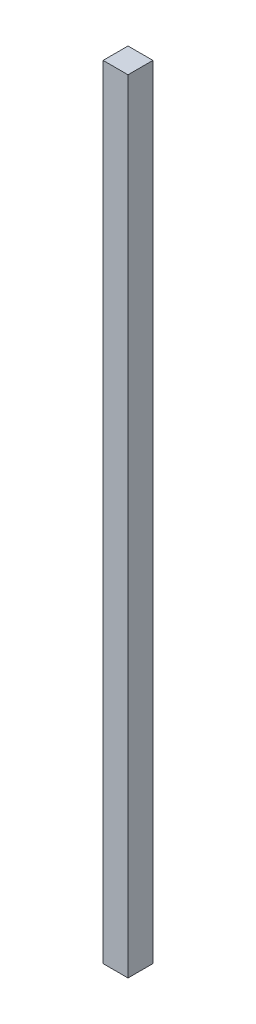
ISO-10303-21;
HEADER;
FILE_DESCRIPTION(('STEP AP214'),'2;1');
FILE_NAME('part.step','',(''),(''),'','','');
FILE_SCHEMA(('AUTOMOTIVE_DESIGN { 1 0 10303 214 1 1 1 1 }'));
ENDSEC;
DATA;
#1=APPLICATION_CONTEXT('core data for automotive mechanical design processes');
#2=APPLICATION_PROTOCOL_DEFINITION('international standard','automotive_design',2000,#1);
#3=PRODUCT_CONTEXT('',#1,'mechanical');
#4=PRODUCT('Part','Part','',(#3));
#5=PRODUCT_RELATED_PRODUCT_CATEGORY('part','',(#4));
#6=PRODUCT_DEFINITION_FORMATION('','',#4);
#7=PRODUCT_DEFINITION_CONTEXT('part definition',#1,'design');
#8=PRODUCT_DEFINITION('design','',#6,#7);
#9=PRODUCT_DEFINITION_SHAPE('','',#8);
#10=(LENGTH_UNIT() NAMED_UNIT(*) SI_UNIT(.MILLI.,.METRE.));
#11=(NAMED_UNIT(*) PLANE_ANGLE_UNIT() SI_UNIT($,.RADIAN.));
#12=(NAMED_UNIT(*) SI_UNIT($,.STERADIAN.) SOLID_ANGLE_UNIT());
#13=UNCERTAINTY_MEASURE_WITH_UNIT(LENGTH_MEASURE(1.E-05),#10,'distance_accuracy_value','');
#14=(GEOMETRIC_REPRESENTATION_CONTEXT(3) GLOBAL_UNCERTAINTY_ASSIGNED_CONTEXT((#13)) GLOBAL_UNIT_ASSIGNED_CONTEXT((#10,
#11,#12)) REPRESENTATION_CONTEXT('',''));
#15=CARTESIAN_POINT('',(0.,0.,0.));
#16=DIRECTION('',(0.,0.,1.));
#17=DIRECTION('',(1.,0.,0.));
#18=AXIS2_PLACEMENT_3D('',#15,#16,#17);
#19=CARTESIAN_POINT('',(-5.94468085106385,797.56,-14.7265957446808));
#20=DIRECTION('',(1.,0.,0.));
#21=DIRECTION('',(0.,0.,-1.));
#22=AXIS2_PLACEMENT_3D('',#19,#20,#21);
#23=PLANE('',#22);
#24=DIRECTION('',(0.,0.,1.));
#25=VECTOR('',#24,1.);
#26=CARTESIAN_POINT('',(-5.94468085106385,0.,-14.7265957446808));
#27=LINE('',#26,#25);
#28=CARTESIAN_POINT('',(-5.94468085106385,0.,-14.7265957446808));
#29=VERTEX_POINT('',#28);
#30=CARTESIAN_POINT('',(-5.94468085106384,0.,10.6734042553192));
#31=VERTEX_POINT('',#30);
#32=EDGE_CURVE('E96',#29,#31,#27,.T.);
#33=ORIENTED_EDGE('',*,*,#32,.T.);
#34=DIRECTION('',(0.,-1.,0.));
#35=VECTOR('',#34,1.);
#36=CARTESIAN_POINT('',(-5.94468085106384,797.56,10.6734042553192));
#37=LINE('',#36,#35);
#38=CARTESIAN_POINT('',(-5.94468085106384,797.56,10.6734042553192));
#39=VERTEX_POINT('',#38);
#40=EDGE_CURVE('E11',#39,#31,#37,.T.);
#41=ORIENTED_EDGE('',*,*,#40,.F.);
#42=DIRECTION('',(0.,0.,1.));
#43=VECTOR('',#42,1.);
#44=CARTESIAN_POINT('',(-5.94468085106385,797.56,-14.7265957446808));
#45=LINE('',#44,#43);
#46=CARTESIAN_POINT('',(-5.94468085106385,797.56,-14.7265957446808));
#47=VERTEX_POINT('',#46);
#48=EDGE_CURVE('E84',#47,#39,#45,.T.);
#49=ORIENTED_EDGE('',*,*,#48,.F.);
#50=DIRECTION('',(0.,-1.,0.));
#51=VECTOR('',#50,1.);
#52=CARTESIAN_POINT('',(-5.94468085106385,797.56,-14.7265957446808));
#53=LINE('',#52,#51);
#54=EDGE_CURVE('E92',#47,#29,#53,.T.);
#55=ORIENTED_EDGE('',*,*,#54,.T.);
#56=EDGE_LOOP('',(#33,#41,#49,#55));
#57=FACE_BOUND('',#56,.T.);
#58=ADVANCED_FACE('F33',(#57),#23,.F.);
#59=CARTESIAN_POINT('',(-5.94468085106384,797.56,10.6734042553192));
#60=DIRECTION('',(0.,0.,-1.));
#61=DIRECTION('',(-1.,0.,0.));
#62=AXIS2_PLACEMENT_3D('',#59,#60,#61);
#63=PLANE('',#62);
#64=DIRECTION('',(1.,0.,0.));
#65=VECTOR('',#64,1.);
#66=CARTESIAN_POINT('',(-5.94468085106384,0.,10.6734042553192));
#67=LINE('',#66,#65);
#68=CARTESIAN_POINT('',(19.4553191489362,0.,10.6734042553192));
#69=VERTEX_POINT('',#68);
#70=EDGE_CURVE('E88',#31,#69,#67,.T.);
#71=ORIENTED_EDGE('',*,*,#70,.T.);
#72=DIRECTION('',(0.,-1.,0.));
#73=VECTOR('',#72,1.);
#74=CARTESIAN_POINT('',(19.4553191489362,797.56,10.6734042553192));
#75=LINE('',#74,#73);
#76=CARTESIAN_POINT('',(19.4553191489362,797.56,10.6734042553192));
#77=VERTEX_POINT('',#76);
#78=EDGE_CURVE('E41',#77,#69,#75,.T.);
#79=ORIENTED_EDGE('',*,*,#78,.F.);
#80=DIRECTION('',(1.,0.,0.));
#81=VECTOR('',#80,1.);
#82=CARTESIAN_POINT('',(-5.94468085106384,797.56,10.6734042553192));
#83=LINE('',#82,#81);
#84=EDGE_CURVE('E79',#39,#77,#83,.T.);
#85=ORIENTED_EDGE('',*,*,#84,.F.);
#86=ORIENTED_EDGE('',*,*,#40,.T.);
#87=EDGE_LOOP('',(#71,#79,#85,#86));
#88=FACE_BOUND('',#87,.T.);
#89=ADVANCED_FACE('F87',(#88),#63,.F.);
#90=CARTESIAN_POINT('',(19.4553191489362,797.56,-14.7265957446808));
#91=DIRECTION('',(-1.,0.,0.));
#92=DIRECTION('',(0.,0.,1.));
#93=AXIS2_PLACEMENT_3D('',#90,#91,#92);
#94=PLANE('',#93);
#95=DIRECTION('',(0.,0.,-1.));
#96=VECTOR('',#95,1.);
#97=CARTESIAN_POINT('',(19.4553191489362,0.,-14.7265957446808));
#98=LINE('',#97,#96);
#99=CARTESIAN_POINT('',(19.4553191489362,0.,-14.7265957446808));
#100=VERTEX_POINT('',#99);
#101=EDGE_CURVE('E66',#69,#100,#98,.T.);
#102=ORIENTED_EDGE('',*,*,#101,.T.);
#103=DIRECTION('',(0.,-1.,0.));
#104=VECTOR('',#103,1.);
#105=CARTESIAN_POINT('',(19.4553191489362,797.56,-14.7265957446808));
#106=LINE('',#105,#104);
#107=CARTESIAN_POINT('',(19.4553191489362,797.56,-14.7265957446808));
#108=VERTEX_POINT('',#107);
#109=EDGE_CURVE('E89',#108,#100,#106,.T.);
#110=ORIENTED_EDGE('',*,*,#109,.F.);
#111=DIRECTION('',(0.,0.,-1.));
#112=VECTOR('',#111,1.);
#113=CARTESIAN_POINT('',(19.4553191489362,797.56,-14.7265957446808));
#114=LINE('',#113,#112);
#115=EDGE_CURVE('E82',#77,#108,#114,.T.);
#116=ORIENTED_EDGE('',*,*,#115,.F.);
#117=ORIENTED_EDGE('',*,*,#78,.T.);
#118=EDGE_LOOP('',(#102,#110,#116,#117));
#119=FACE_BOUND('',#118,.T.);
#120=ADVANCED_FACE('F90',(#119),#94,.F.);
#121=CARTESIAN_POINT('',(-5.94468085106385,797.56,-14.7265957446808));
#122=DIRECTION('',(0.,0.,1.));
#123=DIRECTION('',(1.,0.,0.));
#124=AXIS2_PLACEMENT_3D('',#121,#122,#123);
#125=PLANE('',#124);
#126=DIRECTION('',(-1.,0.,0.));
#127=VECTOR('',#126,1.);
#128=CARTESIAN_POINT('',(-5.94468085106385,0.,-14.7265957446808));
#129=LINE('',#128,#127);
#130=EDGE_CURVE('E72',#100,#29,#129,.T.);
#131=ORIENTED_EDGE('',*,*,#130,.T.);
#132=ORIENTED_EDGE('',*,*,#54,.F.);
#133=DIRECTION('',(-1.,0.,0.));
#134=VECTOR('',#133,1.);
#135=CARTESIAN_POINT('',(-5.94468085106385,797.56,-14.7265957446808));
#136=LINE('',#135,#134);
#137=EDGE_CURVE('E49',#108,#47,#136,.T.);
#138=ORIENTED_EDGE('',*,*,#137,.F.);
#139=ORIENTED_EDGE('',*,*,#109,.T.);
#140=EDGE_LOOP('',(#131,#132,#138,#139));
#141=FACE_BOUND('',#140,.T.);
#142=ADVANCED_FACE('F103',(#141),#125,.F.);
#143=CARTESIAN_POINT('',(0.,797.56,0.));
#144=DIRECTION('',(0.,1.,0.));
#145=DIRECTION('',(0.,0.,1.));
#146=AXIS2_PLACEMENT_3D('',#143,#144,#145);
#147=PLANE('',#146);
#148=ORIENTED_EDGE('',*,*,#48,.T.);
#149=ORIENTED_EDGE('',*,*,#84,.T.);
#150=ORIENTED_EDGE('',*,*,#115,.T.);
#151=ORIENTED_EDGE('',*,*,#137,.T.);
#152=EDGE_LOOP('',(#148,#149,#150,#151));
#153=FACE_BOUND('',#152,.T.);
#154=ADVANCED_FACE('F80',(#153),#147,.T.);
#155=CARTESIAN_POINT('',(0.,0.,0.));
#156=DIRECTION('',(0.,1.,0.));
#157=DIRECTION('',(0.,0.,1.));
#158=AXIS2_PLACEMENT_3D('',#155,#156,#157);
#159=PLANE('',#158);
#160=ORIENTED_EDGE('',*,*,#32,.F.);
#161=ORIENTED_EDGE('',*,*,#130,.F.);
#162=ORIENTED_EDGE('',*,*,#101,.F.);
#163=ORIENTED_EDGE('',*,*,#70,.F.);
#164=EDGE_LOOP('',(#160,#161,#162,#163));
#165=FACE_BOUND('',#164,.T.);
#166=ADVANCED_FACE('F106',(#165),#159,.F.);
#167=CLOSED_SHELL('',(#58,#89,#120,#142,#154,#166));
#168=MANIFOLD_SOLID_BREP('B2',#167);
#169=ADVANCED_BREP_SHAPE_REPRESENTATION('',(#18,#168),#14);
#170=SHAPE_DEFINITION_REPRESENTATION(#9,#169);
ENDSEC;
END-ISO-10303-21;
